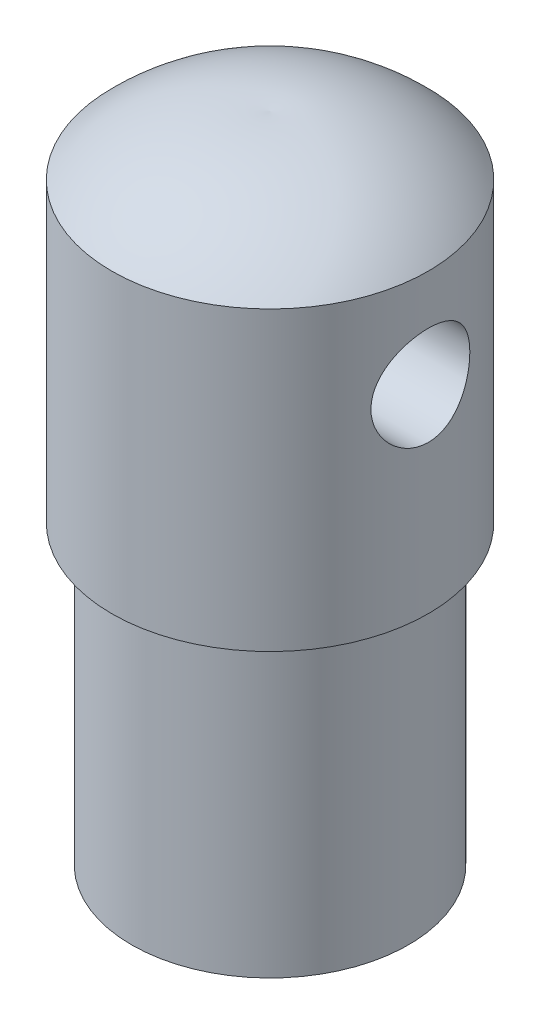
ISO-10303-21;
HEADER;
FILE_DESCRIPTION(('STEP AP214'),'2;1');
FILE_NAME('part.step','',(''),(''),'','','');
FILE_SCHEMA(('AUTOMOTIVE_DESIGN { 1 0 10303 214 1 1 1 1 }'));
ENDSEC;
DATA;
#1=APPLICATION_CONTEXT('core data for automotive mechanical design processes');
#2=APPLICATION_PROTOCOL_DEFINITION('international standard','automotive_design',2000,#1);
#3=PRODUCT_CONTEXT('',#1,'mechanical');
#4=PRODUCT('Part','Part','',(#3));
#5=PRODUCT_RELATED_PRODUCT_CATEGORY('part','',(#4));
#6=PRODUCT_DEFINITION_FORMATION('','',#4);
#7=PRODUCT_DEFINITION_CONTEXT('part definition',#1,'design');
#8=PRODUCT_DEFINITION('design','',#6,#7);
#9=PRODUCT_DEFINITION_SHAPE('','',#8);
#10=(LENGTH_UNIT() NAMED_UNIT(*) SI_UNIT(.MILLI.,.METRE.));
#11=(NAMED_UNIT(*) PLANE_ANGLE_UNIT() SI_UNIT($,.RADIAN.));
#12=(NAMED_UNIT(*) SI_UNIT($,.STERADIAN.) SOLID_ANGLE_UNIT());
#13=UNCERTAINTY_MEASURE_WITH_UNIT(LENGTH_MEASURE(1.E-05),#10,'distance_accuracy_value','');
#14=(GEOMETRIC_REPRESENTATION_CONTEXT(3) GLOBAL_UNCERTAINTY_ASSIGNED_CONTEXT((#13)) GLOBAL_UNIT_ASSIGNED_CONTEXT((#10,
#11,#12)) REPRESENTATION_CONTEXT('',''));
#15=CARTESIAN_POINT('',(0.,0.,0.));
#16=DIRECTION('',(0.,0.,1.));
#17=DIRECTION('',(1.,0.,0.));
#18=AXIS2_PLACEMENT_3D('',#15,#16,#17);
#19=CARTESIAN_POINT('',(0.,15.,0.));
#20=DIRECTION('',(0.,-1.,0.));
#21=DIRECTION('',(0.,0.,-1.));
#22=AXIS2_PLACEMENT_3D('',#19,#20,#21);
#23=CYLINDRICAL_SURFACE('',#22,7.);
#24=CARTESIAN_POINT('',(0.,15.,0.));
#25=DIRECTION('',(0.,1.,0.));
#26=DIRECTION('',(0.,0.,1.));
#27=AXIS2_PLACEMENT_3D('',#24,#25,#26);
#28=CIRCLE('',#27,7.);
#29=CARTESIAN_POINT('',(0.,15.,7.));
#30=VERTEX_POINT('',#29);
#31=EDGE_CURVE('E59',#30,#30,#28,.T.);
#32=ORIENTED_EDGE('',*,*,#31,.F.);
#33=EDGE_LOOP('',(#32));
#34=FACE_BOUND('',#33,.T.);
#35=CARTESIAN_POINT('',(0.,0.,0.));
#36=DIRECTION('',(0.,1.,0.));
#37=DIRECTION('',(0.,0.,1.));
#38=AXIS2_PLACEMENT_3D('',#35,#36,#37);
#39=CIRCLE('',#38,7.);
#40=CARTESIAN_POINT('',(0.,0.,7.));
#41=VERTEX_POINT('',#40);
#42=EDGE_CURVE('E55',#41,#41,#39,.T.);
#43=ORIENTED_EDGE('',*,*,#42,.T.);
#44=EDGE_LOOP('',(#43));
#45=FACE_BOUND('',#44,.T.);
#46=ADVANCED_FACE('F32',(#34,#45),#23,.T.);
#47=CARTESIAN_POINT('',(0.,0.,0.));
#48=DIRECTION('',(0.,1.,0.));
#49=DIRECTION('',(0.,0.,1.));
#50=AXIS2_PLACEMENT_3D('',#47,#48,#49);
#51=PLANE('',#50);
#52=ORIENTED_EDGE('',*,*,#42,.F.);
#53=EDGE_LOOP('',(#52));
#54=FACE_BOUND('',#53,.T.);
#55=ADVANCED_FACE('F80',(#54),#51,.F.);
#56=CARTESIAN_POINT('',(0.,30.,0.));
#57=DIRECTION('',(0.,-1.,0.));
#58=DIRECTION('',(0.,0.,-1.));
#59=AXIS2_PLACEMENT_3D('',#56,#57,#58);
#60=CYLINDRICAL_SURFACE('',#59,8.);
#61=CARTESIAN_POINT('',(-8.,22.5,0.));
#62=CARTESIAN_POINT('',(-7.9999993175598,22.5000008931752,-0.136878370349093));
#63=CARTESIAN_POINT('',(-7.99645389969682,22.5112784538889,-0.273766105005718));
#64=CARTESIAN_POINT('',(-7.98265788177613,22.5559724830785,-0.543538419176897));
#65=CARTESIAN_POINT('',(-7.97240576399719,22.5893939627287,-0.676422085451815));
#66=CARTESIAN_POINT('',(-7.94631631395819,22.6771387423915,-0.934257087301613));
#67=CARTESIAN_POINT('',(-7.9304876299805,22.7314296893059,-1.05922035397161));
#68=CARTESIAN_POINT('',(-7.89487938322185,22.8592346353567,-1.29826960469292));
#69=CARTESIAN_POINT('',(-7.8750991979981,22.9327516635612,-1.41235387088977));
#70=CARTESIAN_POINT('',(-7.83300427480565,23.0993119840347,-1.62993066990456));
#71=CARTESIAN_POINT('',(-7.81063431853978,23.1928417701221,-1.73304005631332));
#72=CARTESIAN_POINT('',(-7.76620092748417,23.3957367848271,-1.92239476407399));
#73=CARTESIAN_POINT('',(-7.74413755046915,23.5051049549891,-2.00863694579739));
#74=CARTESIAN_POINT('',(-7.70222289396344,23.7398891276162,-2.16388672966227));
#75=CARTESIAN_POINT('',(-7.68243976603591,23.8656349550544,-2.23241568300257));
#76=CARTESIAN_POINT('',(-7.64815603598469,24.1275846299637,-2.34719482153343));
#77=CARTESIAN_POINT('',(-7.63365404257377,24.2637857115879,-2.39345087543889));
#78=CARTESIAN_POINT('',(-7.61215213969001,24.5384561549041,-2.46096919860067));
#79=CARTESIAN_POINT('',(-7.60493945859016,24.6767336872777,-2.48294220015729));
#80=CARTESIAN_POINT('',(-7.59820110281901,24.9551862378238,-2.50349110073976));
#81=CARTESIAN_POINT('',(-7.59867338454668,25.0953607416433,-2.50207321991544));
#82=CARTESIAN_POINT('',(-7.60706378150876,25.367748920538,-2.47643649465479));
#83=CARTESIAN_POINT('',(-7.61468683491897,25.5000582517231,-2.45312115738766));
#84=CARTESIAN_POINT('',(-7.63604051304978,25.7587843130747,-2.38581626711252));
#85=CARTESIAN_POINT('',(-7.6497717868623,25.8852004154176,-2.34182451689101));
#86=CARTESIAN_POINT('',(-7.68202088028593,26.1307038888653,-2.23377749362554));
#87=CARTESIAN_POINT('',(-7.70060569321649,26.249657221384,-2.16943851324163));
#88=CARTESIAN_POINT('',(-7.7404371316014,26.4753755357583,-2.02272041475696));
#89=CARTESIAN_POINT('',(-7.76168444789102,26.5821373405074,-1.94033661043155));
#90=CARTESIAN_POINT('',(-7.80563055600986,26.785549886834,-1.75543390836425));
#91=CARTESIAN_POINT('',(-7.82835139211391,26.8815191155594,-1.65216914118564));
#92=CARTESIAN_POINT('',(-7.8718314151916,27.0549437871594,-1.43072881619106));
#93=CARTESIAN_POINT('',(-7.89259045676745,27.1323978584384,-1.31255215469804));
#94=CARTESIAN_POINT('',(-7.93002589780382,27.2670553772026,-1.06332922093091));
#95=CARTESIAN_POINT('',(-7.94666921296415,27.3240962709279,-0.932189813838559));
#96=CARTESIAN_POINT('',(-7.97375911657108,27.4151060017031,-0.661535955565287));
#97=CARTESIAN_POINT('',(-7.98420758650304,27.4490818444768,-0.522024061449215));
#98=CARTESIAN_POINT('',(-7.99742778790027,27.491836085158,-0.244370314580688));
#99=CARTESIAN_POINT('',(-8.00048045790873,27.5015370871871,-0.106383697577685));
#100=CARTESIAN_POINT('',(-7.99939599461967,27.4980675467253,0.169260611465173));
#101=CARTESIAN_POINT('',(-7.9952599116227,27.4849003453548,0.306918348613018));
#102=CARTESIAN_POINT('',(-7.98044727539523,27.4368088147872,0.574438665951699));
#103=CARTESIAN_POINT('',(-7.96993586221374,27.402433464775,0.704409956841875));
#104=CARTESIAN_POINT('',(-7.94360242758579,27.3135712952666,0.956703857722755));
#105=CARTESIAN_POINT('',(-7.92777975028687,27.25908199195,1.07902552089812));
#106=CARTESIAN_POINT('',(-7.89197085518848,27.1300535669026,1.31586481334438));
#107=CARTESIAN_POINT('',(-7.87189253635335,27.0550580250064,1.43011947957558));
#108=CARTESIAN_POINT('',(-7.82986820006859,26.8876935797652,1.64473170192052));
#109=CARTESIAN_POINT('',(-7.80792167695774,26.7953199645107,1.7450854760879));
#110=CARTESIAN_POINT('',(-7.76353989766283,26.5914822198958,1.93317492583804));
#111=CARTESIAN_POINT('',(-7.74111973412883,26.4794066725216,2.02025304679063));
#112=CARTESIAN_POINT('',(-7.69923894191212,26.2417467672465,2.17442500490303));
#113=CARTESIAN_POINT('',(-7.67977826622621,26.116162623946,2.24151915946859));
#114=CARTESIAN_POINT('',(-7.64623564661738,25.855309654259,2.35340166961085));
#115=CARTESIAN_POINT('',(-7.63213292713749,25.7200807011286,2.39827639112025));
#116=CARTESIAN_POINT('',(-7.6110234168862,25.4434550135028,2.4644578863618));
#117=CARTESIAN_POINT('',(-7.60401392602456,25.3020606473129,2.48577362827989));
#118=CARTESIAN_POINT('',(-7.59816585427753,25.0239918248391,2.50358812316251));
#119=CARTESIAN_POINT('',(-7.59897209200284,24.8873930923052,2.50116559243271));
#120=CARTESIAN_POINT('',(-7.60780180751807,24.6166508301161,2.47417636257668));
#121=CARTESIAN_POINT('',(-7.61582494863208,24.4825071862265,2.44961069645024));
#122=CARTESIAN_POINT('',(-7.6379362836678,24.2224119208162,2.37975459827235));
#123=CARTESIAN_POINT('',(-7.65193396380514,24.0963691178133,2.33477284812016));
#124=CARTESIAN_POINT('',(-7.68439408509128,23.853519172932,2.22560454669999));
#125=CARTESIAN_POINT('',(-7.70285743429343,23.7367139158432,2.16141408888474));
#126=CARTESIAN_POINT('',(-7.74306974067005,23.5107080591204,2.01271350026987));
#127=CARTESIAN_POINT('',(-7.76491897845913,23.4019837409995,1.92750667048265));
#128=CARTESIAN_POINT('',(-7.8089799764242,23.200027343776,1.7404179928096));
#129=CARTESIAN_POINT('',(-7.83119183213309,23.1067994220179,1.63853168468878));
#130=CARTESIAN_POINT('',(-7.87434543904947,22.9354349232741,1.41697332564669));
#131=CARTESIAN_POINT('',(-7.89522203461346,22.8578905271001,1.29682914897477));
#132=CARTESIAN_POINT('',(-7.93253538593756,22.7242021697211,1.0445582760273));
#133=CARTESIAN_POINT('',(-7.94897388631644,22.6680497957163,0.912436315590896));
#134=CARTESIAN_POINT('',(-7.97441301466941,22.5828172647831,0.651495270747956));
#135=CARTESIAN_POINT('',(-7.98392481612283,22.5518502653893,0.523340674225092));
#136=CARTESIAN_POINT('',(-7.99671800680967,22.5104432800646,0.263459790880495));
#137=CARTESIAN_POINT('',(-8.00000065679286,22.499999140392,0.131734232279349));
#138=CARTESIAN_POINT('',(-8.,22.5,0.));
#139=B_SPLINE_CURVE_WITH_KNOTS('',3,(#61,#62,#63,#64,#65,#66,#67,#68,#69,#70,#71,#72,#73,#74,
#75,#76,#77,#78,#79,#80,#81,#82,#83,#84,#85,#86,#87,#88,#89,#90,#91,#92,#93,#94,#95,#96,#97,#98,
#99,#100,#101,#102,#103,#104,#105,#106,#107,#108,#109,#110,#111,#112,#113,#114,#115,#116,#117,
#118,#119,#120,#121,#122,#123,#124,#125,#126,#127,#128,#129,#130,#131,#132,#133,#134,#135,#136,
#137,#138),.UNSPECIFIED.,.T.,.F.,(4,2,2,2,2,2,2,2,2,2,2,2,2,2,2,2,2,2,2,2,2,2,2,2,2,2,2,2,2,2,2,
2,2,2,2,2,2,2,4),(0.,0.41015089886502,0.820394646698132,1.23000495840487,1.63967984311678,
2.06075644390316,2.48191134862552,2.91347542494988,3.34492572559054,3.7633830033442,
4.18172900590276,4.58353834844338,4.98539039958126,5.39311285441091,5.80094132020717,
6.227334945592,6.65376014826606,7.0835092137954,7.51312768989108,7.92615137096475,
8.33911471298726,8.74181253445744,9.14456010068999,9.55712649476686,9.96980491418518,
10.3988355742628,10.8278594196742,11.2552023150671,11.6823824779468,12.0902440696666,
12.4980866352126,12.8999582681244,13.3019116867944,13.7195902803182,14.1373807476578,
14.5688133627192,15.0000761335177,15.3948927332218,15.7896294154519),.UNSPECIFIED.);
#140=CARTESIAN_POINT('',(-8.,22.5,0.));
#141=VERTEX_POINT('',#140);
#142=EDGE_CURVE('E11',#141,#141,#139,.T.);
#143=ORIENTED_EDGE('',*,*,#142,.T.);
#144=EDGE_LOOP('',(#143));
#145=FACE_BOUND('',#144,.T.);
#146=CARTESIAN_POINT('',(7.59934207678533,25.,-2.5));
#147=CARTESIAN_POINT('',(7.59934291923872,24.8633059277813,-2.49999907560094));
#148=CARTESIAN_POINT('',(7.60307063010085,24.7266024625936,-2.48875077582989));
#149=CARTESIAN_POINT('',(7.61751277997754,24.4572116782444,-2.44418350802654));
#150=CARTESIAN_POINT('',(7.62822910706272,24.3245254545357,-2.4108585756503));
#151=CARTESIAN_POINT('',(7.65531877671919,24.067110196136,-2.32339576447118));
#152=CARTESIAN_POINT('',(7.67168210388634,23.9423675337886,-2.26929471473354));
#153=CARTESIAN_POINT('',(7.70820812437377,23.703694608272,-2.14193828346314));
#154=CARTESIAN_POINT('',(7.72837148871681,23.5897662600798,-2.06867951811264));
#155=CARTESIAN_POINT('',(7.7710025533724,23.372042265013,-1.90239214124459));
#156=CARTESIAN_POINT('',(7.79352246769561,23.268672781128,-1.8088187994408));
#157=CARTESIAN_POINT('',(7.83788491720671,23.0788079735816,-1.60572409291099));
#158=CARTESIAN_POINT('',(7.85972735745255,22.9923150061103,-1.49620050503713));
#159=CARTESIAN_POINT('',(7.90087106780156,22.8367778739775,-1.26125182498672));
#160=CARTESIAN_POINT('',(7.9201036912556,22.7681725923371,-1.13552311304019));
#161=CARTESIAN_POINT('',(7.95325103666038,22.6532479002889,-0.873608465706806));
#162=CARTESIAN_POINT('',(7.9671670083984,22.6069232517008,-0.737424996974103));
#163=CARTESIAN_POINT('',(7.98774351641724,22.5392977438059,-0.462928713932197));
#164=CARTESIAN_POINT('',(7.99461477968283,22.5172685004243,-0.324811430936433));
#165=CARTESIAN_POINT('',(8.00107191752033,22.496551307125,-0.0466816279690395));
#166=CARTESIAN_POINT('',(8.00065944820141,22.4978580512824,0.0933304539461723));
#167=CARTESIAN_POINT('',(7.99274232265063,22.5232965831719,0.366148960709462));
#168=CARTESIAN_POINT('',(7.98548301944274,22.546638767026,0.499037268628064));
#169=CARTESIAN_POINT('',(7.9649896512175,22.614189980086,0.75890612669556));
#170=CARTESIAN_POINT('',(7.95175519654419,22.6584003701733,0.88588629096247));
#171=CARTESIAN_POINT('',(7.92046919458913,22.7669403781496,1.13215620630948));
#172=CARTESIAN_POINT('',(7.90236067233341,22.8315096171255,1.25133281124535));
#173=CARTESIAN_POINT('',(7.86323445907697,22.9787421994097,1.47740502230436));
#174=CARTESIAN_POINT('',(7.84221603291309,23.0614101182777,1.58429751241882));
#175=CARTESIAN_POINT('',(7.79847341467063,23.2465472696004,1.78747539690657));
#176=CARTESIAN_POINT('',(7.77571463969686,23.3496981376742,1.88313309818382));
#177=CARTESIAN_POINT('',(7.73181230889308,23.5707902036571,2.05597948519529));
#178=CARTESIAN_POINT('',(7.71066894351396,23.6887331411807,2.13316599552377));
#179=CARTESIAN_POINT('',(7.6722169326579,23.9378349376951,2.26760930038169));
#180=CARTESIAN_POINT('',(7.65495380588195,24.0691268179819,2.32463361399527));
#181=CARTESIAN_POINT('',(7.62675090557699,24.340118983684,2.41556691891091));
#182=CARTESIAN_POINT('',(7.61580886035023,24.4798162283887,2.44948421530003));
#183=CARTESIAN_POINT('',(7.60199126814082,24.7576399051543,2.4920297037281));
#184=CARTESIAN_POINT('',(7.59880932787513,24.8956039924703,2.50161908707794));
#185=CARTESIAN_POINT('',(7.6000215491985,25.1711794829903,2.49793488996242));
#186=CARTESIAN_POINT('',(7.60441454014633,25.3087909373993,2.48466484222813));
#187=CARTESIAN_POINT('',(7.61997914967832,25.5756165933048,2.43649747026382));
#188=CARTESIAN_POINT('',(7.63095108204022,25.7049585481484,2.40223662321101));
#189=CARTESIAN_POINT('',(7.65822574662762,25.9560435839917,2.31380747322029));
#190=CARTESIAN_POINT('',(7.67452934824624,26.0777854218423,2.25963592342302));
#191=CARTESIAN_POINT('',(7.71121079306468,26.3140782195436,2.13115021311757));
#192=CARTESIAN_POINT('',(7.73169206979508,26.4283228311856,2.05630294977117));
#193=CARTESIAN_POINT('',(7.77420697945615,26.6429806927238,1.8892128173596));
#194=CARTESIAN_POINT('',(7.79624101471394,26.7433903378507,1.79696542938156));
#195=CARTESIAN_POINT('',(7.84048375125371,26.9318207318256,1.59314589550721));
#196=CARTESIAN_POINT('',(7.86266184571362,27.0191555722797,1.48093129957704));
#197=CARTESIAN_POINT('',(7.90378119687353,27.1737820866425,1.24290309130279));
#198=CARTESIAN_POINT('',(7.92272260181891,27.2410746786221,1.11709010221725));
#199=CARTESIAN_POINT('',(7.95512623857025,27.3530611249434,0.856211046663665));
#200=CARTESIAN_POINT('',(7.968627991224,27.3979185756874,0.721220368567513));
#201=CARTESIAN_POINT('',(7.98880485297152,27.4641450771794,0.445114508112781));
#202=CARTESIAN_POINT('',(7.99548209828555,27.485521478167,0.304001256680715));
#203=CARTESIAN_POINT('',(8.00111606808923,27.5035820034992,0.0259698732978002));
#204=CARTESIAN_POINT('',(8.0003825881478,27.5012569003415,-0.110878383893042));
#205=CARTESIAN_POINT('',(7.99201956162097,27.4743763779026,-0.382146443846494));
#206=CARTESIAN_POINT('',(7.98439046465238,27.4498224080161,-0.516566404359135));
#207=CARTESIAN_POINT('',(7.96319141689591,27.3798119815555,-0.777510236961581));
#208=CARTESIAN_POINT('',(7.9496969592041,27.3346207843093,-0.904111836898961));
#209=CARTESIAN_POINT('',(7.918158911759,27.224858345583,-1.14799685100018));
#210=CARTESIAN_POINT('',(7.90011454182716,27.1602837800531,-1.26527866254896));
#211=CARTESIAN_POINT('',(7.86059793766752,27.0110544833111,-1.49152338993938));
#212=CARTESIAN_POINT('',(7.83903019501924,26.9257929550721,-1.60006921410622));
#213=CARTESIAN_POINT('',(7.79517473094122,26.7386802211131,-1.80164158279864));
#214=CARTESIAN_POINT('',(7.77288679569653,26.6368240517212,-1.89466346700832));
#215=CARTESIAN_POINT('',(7.72923785154876,26.4153685603178,-2.06565731822505));
#216=CARTESIAN_POINT('',(7.70793201726912,26.2952931937669,-2.14302855989422));
#217=CARTESIAN_POINT('',(7.66960250559062,26.0432037594617,-2.27640941497043));
#218=CARTESIAN_POINT('',(7.65257709722773,25.9111945470995,-2.33242766807092));
#219=CARTESIAN_POINT('',(7.62613120880655,25.6505547653707,-2.41742360871585));
#220=CARTESIAN_POINT('',(7.61618630087498,25.5225949050969,-2.44829879675747));
#221=CARTESIAN_POINT('',(7.60279212964797,25.263092335807,-2.48958491632199));
#222=CARTESIAN_POINT('',(7.59934126603196,25.131550517597,-2.50000088961557));
#223=CARTESIAN_POINT('',(7.59934207678533,25.,-2.5));
#224=B_SPLINE_CURVE_WITH_KNOTS('',3,(#146,#147,#148,#149,#150,#151,#152,#153,#154,#155,#156,
#157,#158,#159,#160,#161,#162,#163,#164,#165,#166,#167,#168,#169,#170,#171,#172,#173,#174,#175,
#176,#177,#178,#179,#180,#181,#182,#183,#184,#185,#186,#187,#188,#189,#190,#191,#192,#193,#194,
#195,#196,#197,#198,#199,#200,#201,#202,#203,#204,#205,#206,#207,#208,#209,#210,#211,#212,#213,
#214,#215,#216,#217,#218,#219,#220,#221,#222,#223),.UNSPECIFIED.,.T.,.F.,(4,2,2,2,2,2,2,2,2,2,2,
2,2,2,2,2,2,2,2,2,2,2,2,2,2,2,2,2,2,2,2,2,2,2,2,2,2,2,4),(0.,0.409596275096981,
0.819303254119471,1.22828728823716,1.6373436098499,2.05914161101677,2.48099845882246,
2.91239643927466,3.34369294835844,3.76167445671067,4.17956092943549,4.58301965939501,
4.98650470380186,5.39492809216818,5.80345485426375,6.22900677874668,6.65460879707552,
7.08496941871144,7.51517527910369,7.92809866580735,8.34095824443042,8.7418794409359,
9.14286604511284,9.55535226624085,9.96794576028624,10.3976387562789,10.8273120663904,
11.2538047858686,11.6801639628603,12.0887760488391,12.4973614938948,12.9008369303438,
13.3043815982817,13.7216138621529,14.1389711554925,14.5701559100827,15.0011660161251,
15.3954470874764,15.7896309838242),.UNSPECIFIED.);
#225=CARTESIAN_POINT('',(7.59934207678533,25.,-2.5));
#226=VERTEX_POINT('',#225);
#227=EDGE_CURVE('E42',#226,#226,#224,.T.);
#228=ORIENTED_EDGE('',*,*,#227,.T.);
#229=EDGE_LOOP('',(#228));
#230=FACE_BOUND('',#229,.T.);
#231=CARTESIAN_POINT('',(0.,30.,0.));
#232=DIRECTION('',(0.,1.,0.));
#233=DIRECTION('',(0.,0.,1.));
#234=AXIS2_PLACEMENT_3D('',#231,#232,#233);
#235=CIRCLE('',#234,8.);
#236=CARTESIAN_POINT('',(0.,30.,8.));
#237=VERTEX_POINT('',#236);
#238=EDGE_CURVE('E53',#237,#237,#235,.T.);
#239=ORIENTED_EDGE('',*,*,#238,.F.);
#240=EDGE_LOOP('',(#239));
#241=FACE_BOUND('',#240,.T.);
#242=CARTESIAN_POINT('',(0.,15.,0.));
#243=DIRECTION('',(0.,1.,0.));
#244=DIRECTION('',(0.,0.,1.));
#245=AXIS2_PLACEMENT_3D('',#242,#243,#244);
#246=CIRCLE('',#245,8.);
#247=CARTESIAN_POINT('',(0.,15.,8.));
#248=VERTEX_POINT('',#247);
#249=EDGE_CURVE('E56',#248,#248,#246,.T.);
#250=ORIENTED_EDGE('',*,*,#249,.T.);
#251=EDGE_LOOP('',(#250));
#252=FACE_BOUND('',#251,.T.);
#253=ADVANCED_FACE('F68',(#145,#230,#241,#252),#60,.T.);
#254=CARTESIAN_POINT('',(0.,15.,0.));
#255=DIRECTION('',(0.,1.,0.));
#256=DIRECTION('',(0.,0.,1.));
#257=AXIS2_PLACEMENT_3D('',#254,#255,#256);
#258=PLANE('',#257);
#259=ORIENTED_EDGE('',*,*,#31,.T.);
#260=EDGE_LOOP('',(#259));
#261=FACE_BOUND('',#260,.T.);
#262=ORIENTED_EDGE('',*,*,#249,.F.);
#263=EDGE_LOOP('',(#262));
#264=FACE_BOUND('',#263,.T.);
#265=ADVANCED_FACE('F49',(#261,#264),#258,.F.);
#266=CARTESIAN_POINT('',(0.,23.034113579978,0.82529259249176));
#267=DIRECTION('',(-1.,0.,0.));
#268=DIRECTION('',(0.,0.,1.));
#269=AXIS2_PLACEMENT_3D('',#266,#267,#268);
#270=CIRCLE('',#269,10.);
#271=TRIMMED_CURVE('',#270,(PARAMETER_VALUE(-1.65341955990417)),
(PARAMETER_VALUE(1.65341955990417)),.T.,.PARAMETER.);
#272=CARTESIAN_POINT('',(0.,23.034113579978,0.));
#273=DIRECTION('',(0.,1.,0.));
#274=AXIS1_PLACEMENT('',#272,#273);
#275=SURFACE_OF_REVOLUTION('',#271,#274);
#276=CARTESIAN_POINT('',(0.,33.,0.));
#277=VERTEX_POINT('',#276);
#278=VERTEX_LOOP('',#277);
#279=FACE_BOUND('',#278,.T.);
#280=ORIENTED_EDGE('',*,*,#238,.T.);
#281=EDGE_LOOP('',(#280));
#282=FACE_BOUND('',#281,.T.);
#283=ADVANCED_FACE('F45',(#279,#282),#275,.T.);
#284=CARTESIAN_POINT('',(-8.,25.,0.));
#285=DIRECTION('',(1.,0.,0.));
#286=DIRECTION('',(0.,0.,-1.));
#287=AXIS2_PLACEMENT_3D('',#284,#285,#286);
#288=CYLINDRICAL_SURFACE('',#287,2.5);
#289=ORIENTED_EDGE('',*,*,#227,.F.);
#290=EDGE_LOOP('',(#289));
#291=FACE_BOUND('',#290,.T.);
#292=ORIENTED_EDGE('',*,*,#142,.F.);
#293=EDGE_LOOP('',(#292));
#294=FACE_BOUND('',#293,.T.);
#295=ADVANCED_FACE('F48',(#291,#294),#288,.F.);
#296=CLOSED_SHELL('',(#46,#55,#253,#265,#283,#295));
#297=MANIFOLD_SOLID_BREP('B2',#296);
#298=ADVANCED_BREP_SHAPE_REPRESENTATION('',(#18,#297),#14);
#299=SHAPE_DEFINITION_REPRESENTATION(#9,#298);
ENDSEC;
END-ISO-10303-21;
